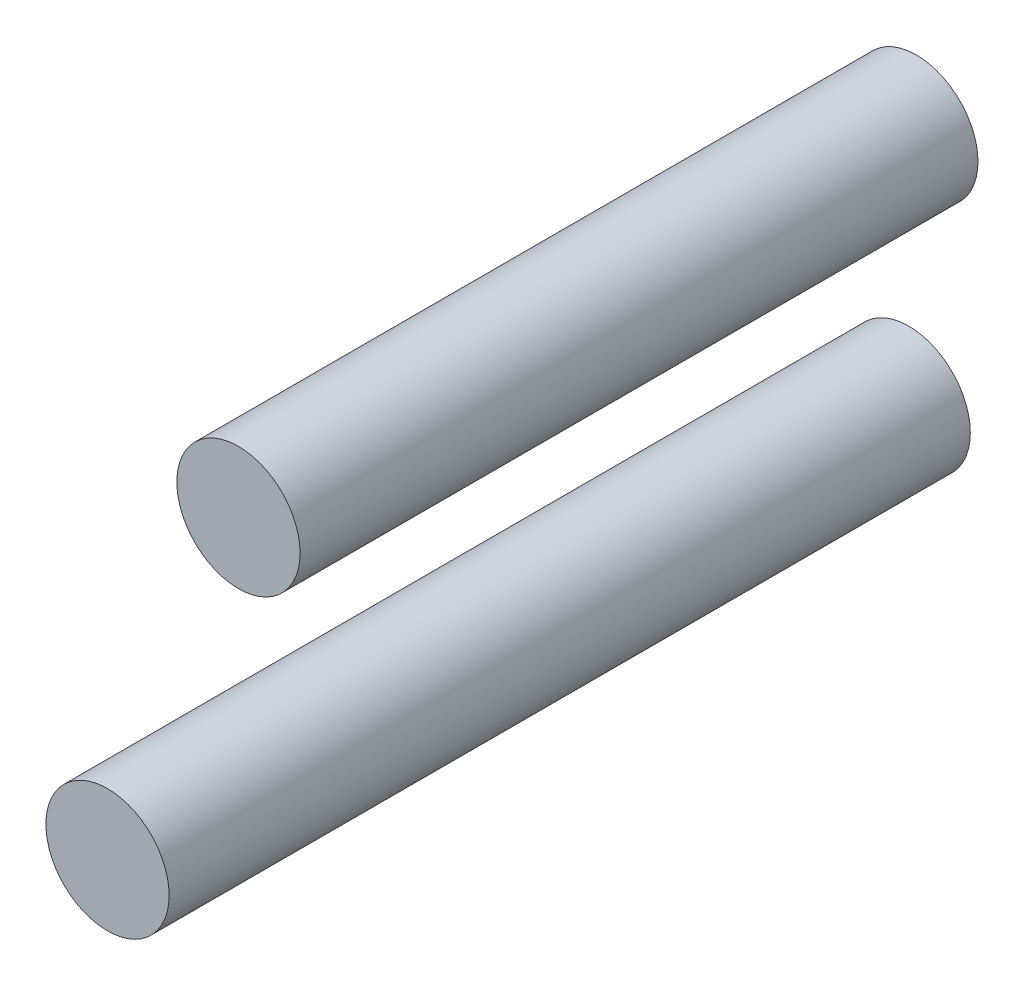
ISO-10303-21;
HEADER;
FILE_DESCRIPTION(('STEP AP214'),'2;1');
FILE_NAME('part.step','',(''),(''),'','','');
FILE_SCHEMA(('AUTOMOTIVE_DESIGN { 1 0 10303 214 1 1 1 1 }'));
ENDSEC;
DATA;
#1=APPLICATION_CONTEXT('core data for automotive mechanical design processes');
#2=APPLICATION_PROTOCOL_DEFINITION('international standard','automotive_design',2000,#1);
#3=PRODUCT_CONTEXT('',#1,'mechanical');
#4=PRODUCT('Part','Part','',(#3));
#5=PRODUCT_RELATED_PRODUCT_CATEGORY('part','',(#4));
#6=PRODUCT_DEFINITION_FORMATION('','',#4);
#7=PRODUCT_DEFINITION_CONTEXT('part definition',#1,'design');
#8=PRODUCT_DEFINITION('design','',#6,#7);
#9=PRODUCT_DEFINITION_SHAPE('','',#8);
#10=(LENGTH_UNIT() NAMED_UNIT(*) SI_UNIT(.MILLI.,.METRE.));
#11=(NAMED_UNIT(*) PLANE_ANGLE_UNIT() SI_UNIT($,.RADIAN.));
#12=(NAMED_UNIT(*) SI_UNIT($,.STERADIAN.) SOLID_ANGLE_UNIT());
#13=UNCERTAINTY_MEASURE_WITH_UNIT(LENGTH_MEASURE(1.E-05),#10,'distance_accuracy_value','');
#14=(GEOMETRIC_REPRESENTATION_CONTEXT(3) GLOBAL_UNCERTAINTY_ASSIGNED_CONTEXT((#13)) GLOBAL_UNIT_ASSIGNED_CONTEXT((#10,
#11,#12)) REPRESENTATION_CONTEXT('',''));
#15=CARTESIAN_POINT('',(0.,0.,0.));
#16=DIRECTION('',(0.,0.,1.));
#17=DIRECTION('',(1.,0.,0.));
#18=AXIS2_PLACEMENT_3D('',#15,#16,#17);
#19=CARTESIAN_POINT('',(-13.752447282807,48.7185032392618,55.));
#20=DIRECTION('',(0.,0.,-1.));
#21=DIRECTION('',(-1.,0.,0.));
#22=AXIS2_PLACEMENT_3D('',#19,#20,#21);
#23=CYLINDRICAL_SURFACE('',#22,10.);
#24=CARTESIAN_POINT('',(-13.752447282807,48.7185032392618,55.));
#25=DIRECTION('',(0.,0.,1.));
#26=DIRECTION('',(1.,0.,0.));
#27=AXIS2_PLACEMENT_3D('',#24,#25,#26);
#28=CIRCLE('',#27,10.);
#29=CARTESIAN_POINT('',(-3.752447282807,48.7185032392618,55.));
#30=VERTEX_POINT('',#29);
#31=EDGE_CURVE('E11',#30,#30,#28,.T.);
#32=ORIENTED_EDGE('',*,*,#31,.F.);
#33=EDGE_LOOP('',(#32));
#34=FACE_BOUND('',#33,.T.);
#35=CARTESIAN_POINT('',(-13.752447282807,48.7185032392618,-55.));
#36=DIRECTION('',(0.,0.,1.));
#37=DIRECTION('',(1.,0.,0.));
#38=AXIS2_PLACEMENT_3D('',#35,#36,#37);
#39=CIRCLE('',#38,10.);
#40=CARTESIAN_POINT('',(-3.752447282807,48.7185032392618,-55.));
#41=VERTEX_POINT('',#40);
#42=EDGE_CURVE('E42',#41,#41,#39,.T.);
#43=ORIENTED_EDGE('',*,*,#42,.T.);
#44=EDGE_LOOP('',(#43));
#45=FACE_BOUND('',#44,.T.);
#46=ADVANCED_FACE('F39',(#34,#45),#23,.T.);
#47=CARTESIAN_POINT('',(-13.752447282807,48.7185032392618,55.));
#48=DIRECTION('',(0.,0.,1.));
#49=DIRECTION('',(1.,0.,0.));
#50=AXIS2_PLACEMENT_3D('',#47,#48,#49);
#51=PLANE('',#50);
#52=ORIENTED_EDGE('',*,*,#31,.T.);
#53=EDGE_LOOP('',(#52));
#54=FACE_BOUND('',#53,.T.);
#55=ADVANCED_FACE('F54',(#54),#51,.T.);
#56=CARTESIAN_POINT('',(-13.752447282807,48.7185032392618,-55.));
#57=DIRECTION('',(0.,0.,1.));
#58=DIRECTION('',(1.,0.,0.));
#59=AXIS2_PLACEMENT_3D('',#56,#57,#58);
#60=PLANE('',#59);
#61=ORIENTED_EDGE('',*,*,#42,.F.);
#62=EDGE_LOOP('',(#61));
#63=FACE_BOUND('',#62,.T.);
#64=ADVANCED_FACE('F52',(#63),#60,.F.);
#65=CLOSED_SHELL('',(#46,#55,#64));
#66=MANIFOLD_SOLID_BREP('B2',#65);
#67=CARTESIAN_POINT('',(-25.,0.,65.));
#68=DIRECTION('',(0.,0.,-1.));
#69=DIRECTION('',(-1.,0.,0.));
#70=AXIS2_PLACEMENT_3D('',#67,#68,#69);
#71=CYLINDRICAL_SURFACE('',#70,10.);
#72=CARTESIAN_POINT('',(-25.,0.,65.));
#73=DIRECTION('',(0.,0.,1.));
#74=DIRECTION('',(1.,0.,0.));
#75=AXIS2_PLACEMENT_3D('',#72,#73,#74);
#76=CIRCLE('',#75,10.);
#77=CARTESIAN_POINT('',(-15.,0.,65.));
#78=VERTEX_POINT('',#77);
#79=EDGE_CURVE('E38',#78,#78,#76,.T.);
#80=ORIENTED_EDGE('',*,*,#79,.F.);
#81=EDGE_LOOP('',(#80));
#82=FACE_BOUND('',#81,.T.);
#83=CARTESIAN_POINT('',(-25.,0.,-65.));
#84=DIRECTION('',(0.,0.,1.));
#85=DIRECTION('',(1.,0.,0.));
#86=AXIS2_PLACEMENT_3D('',#83,#84,#85);
#87=CIRCLE('',#86,10.);
#88=CARTESIAN_POINT('',(-15.,0.,-65.));
#89=VERTEX_POINT('',#88);
#90=EDGE_CURVE('E83',#89,#89,#87,.T.);
#91=ORIENTED_EDGE('',*,*,#90,.T.);
#92=EDGE_LOOP('',(#91));
#93=FACE_BOUND('',#92,.T.);
#94=ADVANCED_FACE('F80',(#82,#93),#71,.T.);
#95=CARTESIAN_POINT('',(-25.,0.,65.));
#96=DIRECTION('',(0.,0.,1.));
#97=DIRECTION('',(1.,0.,0.));
#98=AXIS2_PLACEMENT_3D('',#95,#96,#97);
#99=PLANE('',#98);
#100=ORIENTED_EDGE('',*,*,#79,.T.);
#101=EDGE_LOOP('',(#100));
#102=FACE_BOUND('',#101,.T.);
#103=ADVANCED_FACE('F95',(#102),#99,.T.);
#104=CARTESIAN_POINT('',(-25.,0.,-65.));
#105=DIRECTION('',(0.,0.,1.));
#106=DIRECTION('',(1.,0.,0.));
#107=AXIS2_PLACEMENT_3D('',#104,#105,#106);
#108=PLANE('',#107);
#109=ORIENTED_EDGE('',*,*,#90,.F.);
#110=EDGE_LOOP('',(#109));
#111=FACE_BOUND('',#110,.T.);
#112=ADVANCED_FACE('F93',(#111),#108,.F.);
#113=CLOSED_SHELL('',(#94,#103,#112));
#114=MANIFOLD_SOLID_BREP('B6',#113);
#115=ADVANCED_BREP_SHAPE_REPRESENTATION('',(#18,#66,#114),#14);
#116=SHAPE_DEFINITION_REPRESENTATION(#9,#115);
ENDSEC;
END-ISO-10303-21;
